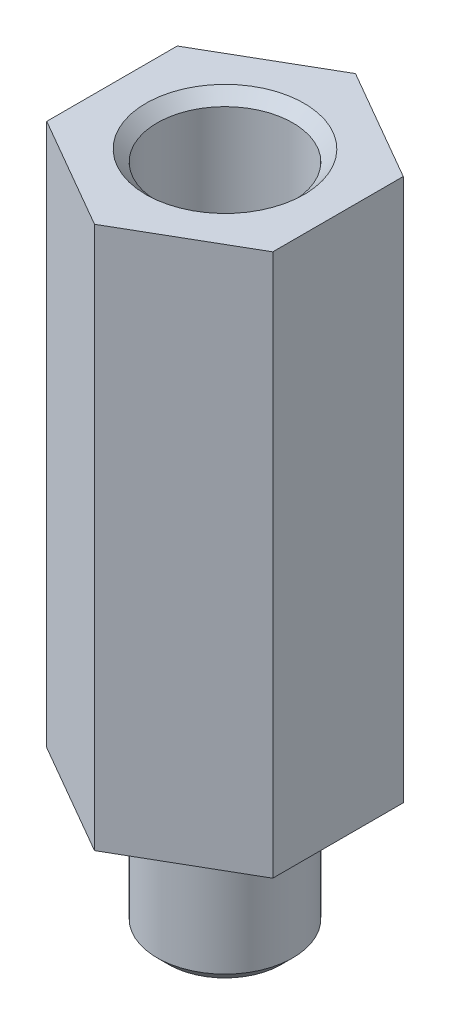
ISO-10303-21;
HEADER;
FILE_DESCRIPTION(('STEP AP214'),'2;1');
FILE_NAME('part.step','',(''),(''),'','','');
FILE_SCHEMA(('AUTOMOTIVE_DESIGN { 1 0 10303 214 1 1 1 1 }'));
ENDSEC;
DATA;
#1=APPLICATION_CONTEXT('core data for automotive mechanical design processes');
#2=APPLICATION_PROTOCOL_DEFINITION('international standard','automotive_design',2000,#1);
#3=PRODUCT_CONTEXT('',#1,'mechanical');
#4=PRODUCT('Part','Part','',(#3));
#5=PRODUCT_RELATED_PRODUCT_CATEGORY('part','',(#4));
#6=PRODUCT_DEFINITION_FORMATION('','',#4);
#7=PRODUCT_DEFINITION_CONTEXT('part definition',#1,'design');
#8=PRODUCT_DEFINITION('design','',#6,#7);
#9=PRODUCT_DEFINITION_SHAPE('','',#8);
#10=(LENGTH_UNIT() NAMED_UNIT(*) SI_UNIT(.MILLI.,.METRE.));
#11=(NAMED_UNIT(*) PLANE_ANGLE_UNIT() SI_UNIT($,.RADIAN.));
#12=(NAMED_UNIT(*) SI_UNIT($,.STERADIAN.) SOLID_ANGLE_UNIT());
#13=UNCERTAINTY_MEASURE_WITH_UNIT(LENGTH_MEASURE(1.E-05),#10,'distance_accuracy_value','');
#14=(GEOMETRIC_REPRESENTATION_CONTEXT(3) GLOBAL_UNCERTAINTY_ASSIGNED_CONTEXT((#13)) GLOBAL_UNIT_ASSIGNED_CONTEXT((#10,
#11,#12)) REPRESENTATION_CONTEXT('',''));
#15=CARTESIAN_POINT('',(0.,0.,0.));
#16=DIRECTION('',(0.,0.,1.));
#17=DIRECTION('',(1.,0.,0.));
#18=AXIS2_PLACEMENT_3D('',#15,#16,#17);
#19=CARTESIAN_POINT('',(2.5,6.,-1.44337567297407));
#20=DIRECTION('',(-0.5,0.,0.866025403784439));
#21=DIRECTION('',(0.866025403784439,0.,0.5));
#22=AXIS2_PLACEMENT_3D('',#19,#20,#21);
#23=PLANE('',#22);
#24=DIRECTION('',(-0.866025403784439,0.,-0.5));
#25=VECTOR('',#24,1.);
#26=CARTESIAN_POINT('',(2.5,-6.,-1.44337567297407));
#27=LINE('',#26,#25);
#28=CARTESIAN_POINT('',(2.5,-6.,-1.44337567297407));
#29=VERTEX_POINT('',#28);
#30=CARTESIAN_POINT('',(0.,-6.,-2.88675134594813));
#31=VERTEX_POINT('',#30);
#32=EDGE_CURVE('E122',#29,#31,#27,.T.);
#33=ORIENTED_EDGE('',*,*,#32,.T.);
#34=DIRECTION('',(0.,-1.,0.));
#35=VECTOR('',#34,1.);
#36=CARTESIAN_POINT('',(0.,6.,-2.88675134594813));
#37=LINE('',#36,#35);
#38=CARTESIAN_POINT('',(0.,6.,-2.88675134594813));
#39=VERTEX_POINT('',#38);
#40=EDGE_CURVE('E140',#39,#31,#37,.T.);
#41=ORIENTED_EDGE('',*,*,#40,.F.);
#42=DIRECTION('',(-0.866025403784439,0.,-0.5));
#43=VECTOR('',#42,1.);
#44=CARTESIAN_POINT('',(2.5,6.,-1.44337567297407));
#45=LINE('',#44,#43);
#46=CARTESIAN_POINT('',(2.5,6.,-1.44337567297407));
#47=VERTEX_POINT('',#46);
#48=EDGE_CURVE('E133',#47,#39,#45,.T.);
#49=ORIENTED_EDGE('',*,*,#48,.F.);
#50=DIRECTION('',(0.,-1.,0.));
#51=VECTOR('',#50,1.);
#52=CARTESIAN_POINT('',(2.5,6.,-1.44337567297407));
#53=LINE('',#52,#51);
#54=EDGE_CURVE('E118',#47,#29,#53,.T.);
#55=ORIENTED_EDGE('',*,*,#54,.T.);
#56=EDGE_LOOP('',(#33,#41,#49,#55));
#57=FACE_BOUND('',#56,.T.);
#58=ADVANCED_FACE('F36',(#57),#23,.F.);
#59=CARTESIAN_POINT('',(0.,6.,-2.88675134594813));
#60=DIRECTION('',(0.5,0.,0.866025403784439));
#61=DIRECTION('',(0.866025403784439,0.,-0.5));
#62=AXIS2_PLACEMENT_3D('',#59,#60,#61);
#63=PLANE('',#62);
#64=DIRECTION('',(-0.866025403784439,0.,0.5));
#65=VECTOR('',#64,1.);
#66=CARTESIAN_POINT('',(0.,-6.,-2.88675134594813));
#67=LINE('',#66,#65);
#68=CARTESIAN_POINT('',(-2.5,-6.,-1.44337567297407));
#69=VERTEX_POINT('',#68);
#70=EDGE_CURVE('E125',#31,#69,#67,.T.);
#71=ORIENTED_EDGE('',*,*,#70,.T.);
#72=DIRECTION('',(0.,-1.,0.));
#73=VECTOR('',#72,1.);
#74=CARTESIAN_POINT('',(-2.5,6.,-1.44337567297407));
#75=LINE('',#74,#73);
#76=CARTESIAN_POINT('',(-2.5,6.,-1.44337567297407));
#77=VERTEX_POINT('',#76);
#78=EDGE_CURVE('E137',#77,#69,#75,.T.);
#79=ORIENTED_EDGE('',*,*,#78,.F.);
#80=DIRECTION('',(-0.866025403784439,0.,0.5));
#81=VECTOR('',#80,1.);
#82=CARTESIAN_POINT('',(0.,6.,-2.88675134594813));
#83=LINE('',#82,#81);
#84=EDGE_CURVE('E91',#39,#77,#83,.T.);
#85=ORIENTED_EDGE('',*,*,#84,.F.);
#86=ORIENTED_EDGE('',*,*,#40,.T.);
#87=EDGE_LOOP('',(#71,#79,#85,#86));
#88=FACE_BOUND('',#87,.T.);
#89=ADVANCED_FACE('F164',(#88),#63,.F.);
#90=CARTESIAN_POINT('',(-2.5,6.,-1.44337567297407));
#91=DIRECTION('',(1.,0.,0.));
#92=DIRECTION('',(0.,0.,-1.));
#93=AXIS2_PLACEMENT_3D('',#90,#91,#92);
#94=PLANE('',#93);
#95=DIRECTION('',(0.,0.,1.));
#96=VECTOR('',#95,1.);
#97=CARTESIAN_POINT('',(-2.5,-6.,-1.44337567297407));
#98=LINE('',#97,#96);
#99=CARTESIAN_POINT('',(-2.5,-6.,1.44337567297406));
#100=VERTEX_POINT('',#99);
#101=EDGE_CURVE('E128',#69,#100,#98,.T.);
#102=ORIENTED_EDGE('',*,*,#101,.T.);
#103=DIRECTION('',(0.,-1.,0.));
#104=VECTOR('',#103,1.);
#105=CARTESIAN_POINT('',(-2.5,6.,1.44337567297406));
#106=LINE('',#105,#104);
#107=CARTESIAN_POINT('',(-2.5,6.,1.44337567297406));
#108=VERTEX_POINT('',#107);
#109=EDGE_CURVE('E113',#108,#100,#106,.T.);
#110=ORIENTED_EDGE('',*,*,#109,.F.);
#111=DIRECTION('',(0.,0.,1.));
#112=VECTOR('',#111,1.);
#113=CARTESIAN_POINT('',(-2.5,6.,-1.44337567297407));
#114=LINE('',#113,#112);
#115=EDGE_CURVE('E104',#77,#108,#114,.T.);
#116=ORIENTED_EDGE('',*,*,#115,.F.);
#117=ORIENTED_EDGE('',*,*,#78,.T.);
#118=EDGE_LOOP('',(#102,#110,#116,#117));
#119=FACE_BOUND('',#118,.T.);
#120=ADVANCED_FACE('F170',(#119),#94,.F.);
#121=CARTESIAN_POINT('',(-2.5,6.,1.44337567297406));
#122=DIRECTION('',(0.5,0.,-0.866025403784438));
#123=DIRECTION('',(-0.866025403784439,0.,-0.5));
#124=AXIS2_PLACEMENT_3D('',#121,#122,#123);
#125=PLANE('',#124);
#126=DIRECTION('',(0.866025403784439,0.,0.5));
#127=VECTOR('',#126,1.);
#128=CARTESIAN_POINT('',(-2.5,-6.,1.44337567297406));
#129=LINE('',#128,#127);
#130=CARTESIAN_POINT('',(0.,-6.,2.88675134594813));
#131=VERTEX_POINT('',#130);
#132=EDGE_CURVE('E112',#100,#131,#129,.T.);
#133=ORIENTED_EDGE('',*,*,#132,.T.);
#134=DIRECTION('',(0.,-1.,0.));
#135=VECTOR('',#134,1.);
#136=CARTESIAN_POINT('',(0.,6.,2.88675134594813));
#137=LINE('',#136,#135);
#138=CARTESIAN_POINT('',(0.,6.,2.88675134594813));
#139=VERTEX_POINT('',#138);
#140=EDGE_CURVE('E109',#139,#131,#137,.T.);
#141=ORIENTED_EDGE('',*,*,#140,.F.);
#142=DIRECTION('',(0.866025403784439,0.,0.5));
#143=VECTOR('',#142,1.);
#144=CARTESIAN_POINT('',(-2.5,6.,1.44337567297406));
#145=LINE('',#144,#143);
#146=EDGE_CURVE('E98',#108,#139,#145,.T.);
#147=ORIENTED_EDGE('',*,*,#146,.F.);
#148=ORIENTED_EDGE('',*,*,#109,.T.);
#149=EDGE_LOOP('',(#133,#141,#147,#148));
#150=FACE_BOUND('',#149,.T.);
#151=ADVANCED_FACE('F110',(#150),#125,.F.);
#152=CARTESIAN_POINT('',(0.,6.,2.88675134594813));
#153=DIRECTION('',(-0.5,0.,-0.866025403784439));
#154=DIRECTION('',(-0.866025403784439,0.,0.5));
#155=AXIS2_PLACEMENT_3D('',#152,#153,#154);
#156=PLANE('',#155);
#157=DIRECTION('',(0.866025403784439,0.,-0.5));
#158=VECTOR('',#157,1.);
#159=CARTESIAN_POINT('',(0.,-6.,2.88675134594813));
#160=LINE('',#159,#158);
#161=CARTESIAN_POINT('',(2.5,-6.,1.44337567297407));
#162=VERTEX_POINT('',#161);
#163=EDGE_CURVE('E76',#131,#162,#160,.T.);
#164=ORIENTED_EDGE('',*,*,#163,.T.);
#165=DIRECTION('',(0.,-1.,0.));
#166=VECTOR('',#165,1.);
#167=CARTESIAN_POINT('',(2.5,6.,1.44337567297407));
#168=LINE('',#167,#166);
#169=CARTESIAN_POINT('',(2.5,6.,1.44337567297407));
#170=VERTEX_POINT('',#169);
#171=EDGE_CURVE('E114',#170,#162,#168,.T.);
#172=ORIENTED_EDGE('',*,*,#171,.F.);
#173=DIRECTION('',(0.866025403784439,0.,-0.5));
#174=VECTOR('',#173,1.);
#175=CARTESIAN_POINT('',(0.,6.,2.88675134594813));
#176=LINE('',#175,#174);
#177=EDGE_CURVE('E102',#139,#170,#176,.T.);
#178=ORIENTED_EDGE('',*,*,#177,.F.);
#179=ORIENTED_EDGE('',*,*,#140,.T.);
#180=EDGE_LOOP('',(#164,#172,#178,#179));
#181=FACE_BOUND('',#180,.T.);
#182=ADVANCED_FACE('F116',(#181),#156,.F.);
#183=CARTESIAN_POINT('',(2.5,6.,1.44337567297407));
#184=DIRECTION('',(-1.,0.,0.));
#185=DIRECTION('',(0.,0.,1.));
#186=AXIS2_PLACEMENT_3D('',#183,#184,#185);
#187=PLANE('',#186);
#188=DIRECTION('',(0.,0.,-1.));
#189=VECTOR('',#188,1.);
#190=CARTESIAN_POINT('',(2.5,-6.,1.44337567297407));
#191=LINE('',#190,#189);
#192=EDGE_CURVE('E82',#162,#29,#191,.T.);
#193=ORIENTED_EDGE('',*,*,#192,.T.);
#194=ORIENTED_EDGE('',*,*,#54,.F.);
#195=DIRECTION('',(0.,0.,-1.));
#196=VECTOR('',#195,1.);
#197=CARTESIAN_POINT('',(2.5,6.,1.44337567297407));
#198=LINE('',#197,#196);
#199=EDGE_CURVE('E53',#170,#47,#198,.T.);
#200=ORIENTED_EDGE('',*,*,#199,.F.);
#201=ORIENTED_EDGE('',*,*,#171,.T.);
#202=EDGE_LOOP('',(#193,#194,#200,#201));
#203=FACE_BOUND('',#202,.T.);
#204=ADVANCED_FACE('F180',(#203),#187,.F.);
#205=CARTESIAN_POINT('',(0.,6.,0.));
#206=DIRECTION('',(0.,1.,0.));
#207=DIRECTION('',(0.,0.,1.));
#208=AXIS2_PLACEMENT_3D('',#205,#206,#207);
#209=PLANE('',#208);
#210=CARTESIAN_POINT('',(0.,6.,0.));
#211=DIRECTION('',(0.,1.,0.));
#212=DIRECTION('',(0.,0.,1.));
#213=AXIS2_PLACEMENT_3D('',#210,#211,#212);
#214=CIRCLE('',#213,1.75);
#215=CARTESIAN_POINT('',(0.,6.,1.75));
#216=VERTEX_POINT('',#215);
#217=EDGE_CURVE('E11',#216,#216,#214,.F.);
#218=ORIENTED_EDGE('',*,*,#217,.T.);
#219=EDGE_LOOP('',(#218));
#220=FACE_BOUND('',#219,.T.);
#221=ORIENTED_EDGE('',*,*,#48,.T.);
#222=ORIENTED_EDGE('',*,*,#84,.T.);
#223=ORIENTED_EDGE('',*,*,#115,.T.);
#224=ORIENTED_EDGE('',*,*,#146,.T.);
#225=ORIENTED_EDGE('',*,*,#177,.T.);
#226=ORIENTED_EDGE('',*,*,#199,.T.);
#227=EDGE_LOOP('',(#221,#222,#223,#224,#225,#226));
#228=FACE_BOUND('',#227,.T.);
#229=ADVANCED_FACE('F100',(#220,#228),#209,.T.);
#230=CARTESIAN_POINT('',(0.,-6.,0.));
#231=DIRECTION('',(0.,1.,0.));
#232=DIRECTION('',(0.,0.,1.));
#233=AXIS2_PLACEMENT_3D('',#230,#231,#232);
#234=PLANE('',#233);
#235=CARTESIAN_POINT('',(0.,-6.,0.));
#236=DIRECTION('',(0.,-1.,0.));
#237=DIRECTION('',(0.,0.,-1.));
#238=AXIS2_PLACEMENT_3D('',#235,#236,#237);
#239=CIRCLE('',#238,1.5);
#240=CARTESIAN_POINT('',(0.,-6.,-1.5));
#241=VERTEX_POINT('',#240);
#242=EDGE_CURVE('E142',#241,#241,#239,.T.);
#243=ORIENTED_EDGE('',*,*,#242,.F.);
#244=EDGE_LOOP('',(#243));
#245=FACE_BOUND('',#244,.T.);
#246=ORIENTED_EDGE('',*,*,#32,.F.);
#247=ORIENTED_EDGE('',*,*,#192,.F.);
#248=ORIENTED_EDGE('',*,*,#163,.F.);
#249=ORIENTED_EDGE('',*,*,#132,.F.);
#250=ORIENTED_EDGE('',*,*,#101,.F.);
#251=ORIENTED_EDGE('',*,*,#70,.F.);
#252=EDGE_LOOP('',(#246,#247,#248,#249,#250,#251));
#253=FACE_BOUND('',#252,.T.);
#254=ADVANCED_FACE('F183',(#245,#253),#234,.F.);
#255=CARTESIAN_POINT('',(0.,-2.,0.));
#256=DIRECTION('',(0.,1.,0.));
#257=DIRECTION('',(0.,0.,1.));
#258=AXIS2_PLACEMENT_3D('',#255,#256,#257);
#259=CYLINDRICAL_SURFACE('',#258,1.5);
#260=CARTESIAN_POINT('',(0.,5.75,0.));
#261=DIRECTION('',(0.,1.,0.));
#262=DIRECTION('',(0.,0.,1.));
#263=AXIS2_PLACEMENT_3D('',#260,#261,#262);
#264=CIRCLE('',#263,1.5);
#265=CARTESIAN_POINT('',(0.,5.75,1.5));
#266=VERTEX_POINT('',#265);
#267=EDGE_CURVE('E45',#266,#266,#264,.T.);
#268=ORIENTED_EDGE('',*,*,#267,.T.);
#269=EDGE_LOOP('',(#268));
#270=FACE_BOUND('',#269,.T.);
#271=CARTESIAN_POINT('',(0.,-2.,0.));
#272=DIRECTION('',(0.,1.,0.));
#273=DIRECTION('',(0.,0.,1.));
#274=AXIS2_PLACEMENT_3D('',#271,#272,#273);
#275=CIRCLE('',#274,1.5);
#276=CARTESIAN_POINT('',(0.,-2.,1.5));
#277=VERTEX_POINT('',#276);
#278=EDGE_CURVE('E126',#277,#277,#275,.T.);
#279=ORIENTED_EDGE('',*,*,#278,.F.);
#280=EDGE_LOOP('',(#279));
#281=FACE_BOUND('',#280,.T.);
#282=ADVANCED_FACE('F151',(#270,#281),#259,.F.);
#283=CARTESIAN_POINT('',(0.,-2.,0.));
#284=DIRECTION('',(0.,1.,0.));
#285=DIRECTION('',(0.,0.,1.));
#286=AXIS2_PLACEMENT_3D('',#283,#284,#285);
#287=PLANE('',#286);
#288=ORIENTED_EDGE('',*,*,#278,.T.);
#289=EDGE_LOOP('',(#288));
#290=FACE_BOUND('',#289,.T.);
#291=ADVANCED_FACE('F192',(#290),#287,.T.);
#292=CARTESIAN_POINT('',(0.,-9.,0.));
#293=DIRECTION('',(0.,1.,0.));
#294=DIRECTION('',(0.,0.,1.));
#295=AXIS2_PLACEMENT_3D('',#292,#293,#294);
#296=CYLINDRICAL_SURFACE('',#295,1.5);
#297=CARTESIAN_POINT('',(0.,-8.75,0.));
#298=DIRECTION('',(0.,-1.,0.));
#299=DIRECTION('',(0.,0.,-1.));
#300=AXIS2_PLACEMENT_3D('',#297,#298,#299);
#301=CIRCLE('',#300,1.5);
#302=CARTESIAN_POINT('',(0.,-8.75,-1.5));
#303=VERTEX_POINT('',#302);
#304=EDGE_CURVE('E146',#303,#303,#301,.F.);
#305=ORIENTED_EDGE('',*,*,#304,.T.);
#306=EDGE_LOOP('',(#305));
#307=FACE_BOUND('',#306,.T.);
#308=ORIENTED_EDGE('',*,*,#242,.T.);
#309=EDGE_LOOP('',(#308));
#310=FACE_BOUND('',#309,.T.);
#311=ADVANCED_FACE('F195',(#307,#310),#296,.T.);
#312=CARTESIAN_POINT('',(0.,-9.,0.));
#313=DIRECTION('',(0.,-1.,0.));
#314=DIRECTION('',(0.,0.,-1.));
#315=AXIS2_PLACEMENT_3D('',#312,#313,#314);
#316=PLANE('',#315);
#317=CARTESIAN_POINT('',(0.,-9.,0.));
#318=DIRECTION('',(0.,-1.,0.));
#319=DIRECTION('',(0.,0.,-1.));
#320=AXIS2_PLACEMENT_3D('',#317,#318,#319);
#321=CIRCLE('',#320,1.25);
#322=CARTESIAN_POINT('',(0.,-9.,-1.25));
#323=VERTEX_POINT('',#322);
#324=EDGE_CURVE('E143',#323,#323,#321,.T.);
#325=ORIENTED_EDGE('',*,*,#324,.T.);
#326=EDGE_LOOP('',(#325));
#327=FACE_BOUND('',#326,.T.);
#328=ADVANCED_FACE('F160',(#327),#316,.T.);
#329=CARTESIAN_POINT('',(0.,-9.,0.));
#330=DIRECTION('',(0.,1.,0.));
#331=DIRECTION('',(0.,0.,1.));
#332=AXIS2_PLACEMENT_3D('',#329,#330,#331);
#333=CONICAL_SURFACE('',#332,1.25,0.785398163397439);
#334=ORIENTED_EDGE('',*,*,#304,.F.);
#335=EDGE_LOOP('',(#334));
#336=FACE_BOUND('',#335,.T.);
#337=ORIENTED_EDGE('',*,*,#324,.F.);
#338=EDGE_LOOP('',(#337));
#339=FACE_BOUND('',#338,.T.);
#340=ADVANCED_FACE('F155',(#336,#339),#333,.T.);
#341=CARTESIAN_POINT('',(0.,5.75,0.));
#342=DIRECTION('',(0.,1.,0.));
#343=DIRECTION('',(0.,0.,1.));
#344=AXIS2_PLACEMENT_3D('',#341,#342,#343);
#345=CONICAL_SURFACE('',#344,1.5,0.785398163397451);
#346=ORIENTED_EDGE('',*,*,#217,.F.);
#347=EDGE_LOOP('',(#346));
#348=FACE_BOUND('',#347,.T.);
#349=ORIENTED_EDGE('',*,*,#267,.F.);
#350=EDGE_LOOP('',(#349));
#351=FACE_BOUND('',#350,.T.);
#352=ADVANCED_FACE('F38',(#348,#351),#345,.F.);
#353=CLOSED_SHELL('',(#58,#89,#120,#151,#182,#204,#229,#254,#282,#291,#311,#328,#340,#352));
#354=MANIFOLD_SOLID_BREP('B2',#353);
#355=ADVANCED_BREP_SHAPE_REPRESENTATION('',(#18,#354),#14);
#356=SHAPE_DEFINITION_REPRESENTATION(#9,#355);
ENDSEC;
END-ISO-10303-21;
